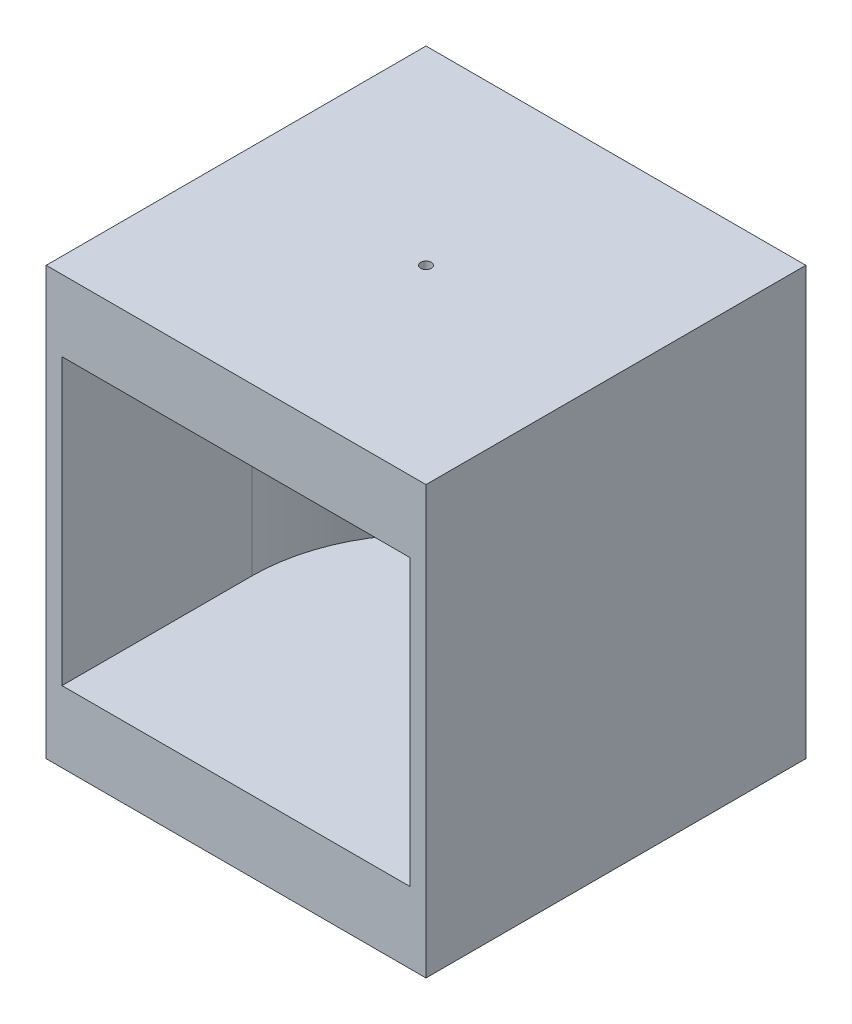
ISO-10303-21;
HEADER;
FILE_DESCRIPTION(('STEP AP214'),'2;1');
FILE_NAME('part.step','',(''),(''),'','','');
FILE_SCHEMA(('AUTOMOTIVE_DESIGN { 1 0 10303 214 1 1 1 1 }'));
ENDSEC;
DATA;
#1=APPLICATION_CONTEXT('core data for automotive mechanical design processes');
#2=APPLICATION_PROTOCOL_DEFINITION('international standard','automotive_design',2000,#1);
#3=PRODUCT_CONTEXT('',#1,'mechanical');
#4=PRODUCT('Part','Part','',(#3));
#5=PRODUCT_RELATED_PRODUCT_CATEGORY('part','',(#4));
#6=PRODUCT_DEFINITION_FORMATION('','',#4);
#7=PRODUCT_DEFINITION_CONTEXT('part definition',#1,'design');
#8=PRODUCT_DEFINITION('design','',#6,#7);
#9=PRODUCT_DEFINITION_SHAPE('','',#8);
#10=(LENGTH_UNIT() NAMED_UNIT(*) SI_UNIT(.MILLI.,.METRE.));
#11=(NAMED_UNIT(*) PLANE_ANGLE_UNIT() SI_UNIT($,.RADIAN.));
#12=(NAMED_UNIT(*) SI_UNIT($,.STERADIAN.) SOLID_ANGLE_UNIT());
#13=UNCERTAINTY_MEASURE_WITH_UNIT(LENGTH_MEASURE(1.E-05),#10,'distance_accuracy_value','');
#14=(GEOMETRIC_REPRESENTATION_CONTEXT(3) GLOBAL_UNCERTAINTY_ASSIGNED_CONTEXT((#13)) GLOBAL_UNIT_ASSIGNED_CONTEXT((#10,
#11,#12)) REPRESENTATION_CONTEXT('',''));
#15=CARTESIAN_POINT('',(0.,0.,0.));
#16=DIRECTION('',(0.,0.,1.));
#17=DIRECTION('',(1.,0.,0.));
#18=AXIS2_PLACEMENT_3D('',#15,#16,#17);
#19=CARTESIAN_POINT('',(-360.,405.,360.));
#20=DIRECTION('',(0.,0.,-1.));
#21=DIRECTION('',(-1.,0.,0.));
#22=AXIS2_PLACEMENT_3D('',#19,#20,#21);
#23=PLANE('',#22);
#24=DIRECTION('',(1.,0.,0.));
#25=VECTOR('',#24,1.);
#26=CARTESIAN_POINT('',(-360.,-405.,360.));
#27=LINE('',#26,#25);
#28=CARTESIAN_POINT('',(-360.,-405.,360.));
#29=VERTEX_POINT('',#28);
#30=CARTESIAN_POINT('',(360.,-405.,360.));
#31=VERTEX_POINT('',#30);
#32=EDGE_CURVE('E84',#29,#31,#27,.T.);
#33=ORIENTED_EDGE('',*,*,#32,.T.);
#34=DIRECTION('',(0.,-1.,0.));
#35=VECTOR('',#34,1.);
#36=CARTESIAN_POINT('',(360.,405.,360.));
#37=LINE('',#36,#35);
#38=CARTESIAN_POINT('',(360.,405.,360.));
#39=VERTEX_POINT('',#38);
#40=EDGE_CURVE('E163',#39,#31,#37,.T.);
#41=ORIENTED_EDGE('',*,*,#40,.F.);
#42=DIRECTION('',(1.,0.,0.));
#43=VECTOR('',#42,1.);
#44=CARTESIAN_POINT('',(-360.,405.,360.));
#45=LINE('',#44,#43);
#46=CARTESIAN_POINT('',(-360.,405.,360.));
#47=VERTEX_POINT('',#46);
#48=EDGE_CURVE('E63',#47,#39,#45,.T.);
#49=ORIENTED_EDGE('',*,*,#48,.F.);
#50=DIRECTION('',(0.,-1.,0.));
#51=VECTOR('',#50,1.);
#52=CARTESIAN_POINT('',(-360.,405.,360.));
#53=LINE('',#52,#51);
#54=EDGE_CURVE('E172',#47,#29,#53,.T.);
#55=ORIENTED_EDGE('',*,*,#54,.T.);
#56=EDGE_LOOP('',(#33,#41,#49,#55));
#57=FACE_BOUND('',#56,.T.);
#58=DIRECTION('',(1.,0.,0.));
#59=VECTOR('',#58,1.);
#60=CARTESIAN_POINT('',(-330.,-270.,360.));
#61=LINE('',#60,#59);
#62=CARTESIAN_POINT('',(-330.,-270.,360.));
#63=VERTEX_POINT('',#62);
#64=CARTESIAN_POINT('',(330.,-270.,360.));
#65=VERTEX_POINT('',#64);
#66=EDGE_CURVE('E133',#63,#65,#61,.T.);
#67=ORIENTED_EDGE('',*,*,#66,.F.);
#68=DIRECTION('',(0.,1.,0.));
#69=VECTOR('',#68,1.);
#70=CARTESIAN_POINT('',(-330.,-270.,360.));
#71=LINE('',#70,#69);
#72=CARTESIAN_POINT('',(-330.,270.,360.));
#73=VERTEX_POINT('',#72);
#74=EDGE_CURVE('E124',#63,#73,#71,.T.);
#75=ORIENTED_EDGE('',*,*,#74,.T.);
#76=DIRECTION('',(1.,0.,0.));
#77=VECTOR('',#76,1.);
#78=CARTESIAN_POINT('',(-330.,270.,360.));
#79=LINE('',#78,#77);
#80=CARTESIAN_POINT('',(330.,270.,360.));
#81=VERTEX_POINT('',#80);
#82=EDGE_CURVE('E138',#73,#81,#79,.T.);
#83=ORIENTED_EDGE('',*,*,#82,.T.);
#84=DIRECTION('',(0.,1.,0.));
#85=VECTOR('',#84,1.);
#86=CARTESIAN_POINT('',(330.,-270.,360.));
#87=LINE('',#86,#85);
#88=EDGE_CURVE('E154',#65,#81,#87,.T.);
#89=ORIENTED_EDGE('',*,*,#88,.F.);
#90=EDGE_LOOP('',(#67,#75,#83,#89));
#91=FACE_BOUND('',#90,.T.);
#92=ADVANCED_FACE('F38',(#57,#91),#23,.F.);
#93=CARTESIAN_POINT('',(360.,405.,360.));
#94=DIRECTION('',(-1.,0.,0.));
#95=DIRECTION('',(0.,0.,1.));
#96=AXIS2_PLACEMENT_3D('',#93,#94,#95);
#97=PLANE('',#96);
#98=DIRECTION('',(0.,0.,-1.));
#99=VECTOR('',#98,1.);
#100=CARTESIAN_POINT('',(360.,-405.,360.));
#101=LINE('',#100,#99);
#102=CARTESIAN_POINT('',(360.,-405.,-360.));
#103=VERTEX_POINT('',#102);
#104=EDGE_CURVE('E153',#31,#103,#101,.T.);
#105=ORIENTED_EDGE('',*,*,#104,.T.);
#106=DIRECTION('',(0.,-1.,0.));
#107=VECTOR('',#106,1.);
#108=CARTESIAN_POINT('',(360.,405.,-360.));
#109=LINE('',#108,#107);
#110=CARTESIAN_POINT('',(360.,405.,-360.));
#111=VERTEX_POINT('',#110);
#112=EDGE_CURVE('E11',#111,#103,#109,.T.);
#113=ORIENTED_EDGE('',*,*,#112,.F.);
#114=DIRECTION('',(0.,0.,-1.));
#115=VECTOR('',#114,1.);
#116=CARTESIAN_POINT('',(360.,405.,360.));
#117=LINE('',#116,#115);
#118=EDGE_CURVE('E157',#39,#111,#117,.T.);
#119=ORIENTED_EDGE('',*,*,#118,.F.);
#120=ORIENTED_EDGE('',*,*,#40,.T.);
#121=EDGE_LOOP('',(#105,#113,#119,#120));
#122=FACE_BOUND('',#121,.T.);
#123=ADVANCED_FACE('F40',(#122),#97,.F.);
#124=CARTESIAN_POINT('',(-360.,405.,-360.));
#125=DIRECTION('',(0.,0.,1.));
#126=DIRECTION('',(1.,0.,0.));
#127=AXIS2_PLACEMENT_3D('',#124,#125,#126);
#128=PLANE('',#127);
#129=DIRECTION('',(-1.,0.,0.));
#130=VECTOR('',#129,1.);
#131=CARTESIAN_POINT('',(-360.,-405.,-360.));
#132=LINE('',#131,#130);
#133=CARTESIAN_POINT('',(-360.,-405.,-360.));
#134=VERTEX_POINT('',#133);
#135=EDGE_CURVE('E166',#103,#134,#132,.T.);
#136=ORIENTED_EDGE('',*,*,#135,.T.);
#137=DIRECTION('',(0.,-1.,0.));
#138=VECTOR('',#137,1.);
#139=CARTESIAN_POINT('',(-360.,405.,-360.));
#140=LINE('',#139,#138);
#141=CARTESIAN_POINT('',(-360.,405.,-360.));
#142=VERTEX_POINT('',#141);
#143=EDGE_CURVE('E47',#142,#134,#140,.T.);
#144=ORIENTED_EDGE('',*,*,#143,.F.);
#145=DIRECTION('',(-1.,0.,0.));
#146=VECTOR('',#145,1.);
#147=CARTESIAN_POINT('',(-360.,405.,-360.));
#148=LINE('',#147,#146);
#149=EDGE_CURVE('E91',#111,#142,#148,.T.);
#150=ORIENTED_EDGE('',*,*,#149,.F.);
#151=ORIENTED_EDGE('',*,*,#112,.T.);
#152=EDGE_LOOP('',(#136,#144,#150,#151));
#153=FACE_BOUND('',#152,.T.);
#154=ADVANCED_FACE('F222',(#153),#128,.F.);
#155=CARTESIAN_POINT('',(-360.,405.,360.));
#156=DIRECTION('',(1.,0.,0.));
#157=DIRECTION('',(0.,0.,-1.));
#158=AXIS2_PLACEMENT_3D('',#155,#156,#157);
#159=PLANE('',#158);
#160=DIRECTION('',(0.,0.,1.));
#161=VECTOR('',#160,1.);
#162=CARTESIAN_POINT('',(-360.,-405.,360.));
#163=LINE('',#162,#161);
#164=EDGE_CURVE('E168',#134,#29,#163,.T.);
#165=ORIENTED_EDGE('',*,*,#164,.T.);
#166=ORIENTED_EDGE('',*,*,#54,.F.);
#167=DIRECTION('',(0.,0.,1.));
#168=VECTOR('',#167,1.);
#169=CARTESIAN_POINT('',(-360.,405.,360.));
#170=LINE('',#169,#168);
#171=EDGE_CURVE('E160',#142,#47,#170,.T.);
#172=ORIENTED_EDGE('',*,*,#171,.F.);
#173=ORIENTED_EDGE('',*,*,#143,.T.);
#174=EDGE_LOOP('',(#165,#166,#172,#173));
#175=FACE_BOUND('',#174,.T.);
#176=ADVANCED_FACE('F178',(#175),#159,.F.);
#177=CARTESIAN_POINT('',(0.,405.,0.));
#178=DIRECTION('',(0.,-1.,0.));
#179=DIRECTION('',(0.,0.,-1.));
#180=AXIS2_PLACEMENT_3D('',#177,#178,#179);
#181=PLANE('',#180);
#182=CARTESIAN_POINT('',(0.,405.,0.));
#183=DIRECTION('',(0.,1.,0.));
#184=DIRECTION('',(0.,0.,1.));
#185=AXIS2_PLACEMENT_3D('',#182,#183,#184);
#186=CIRCLE('',#185,10.);
#187=CARTESIAN_POINT('',(0.,405.,10.));
#188=VERTEX_POINT('',#187);
#189=EDGE_CURVE('E316',#188,#188,#186,.T.);
#190=ORIENTED_EDGE('',*,*,#189,.F.);
#191=EDGE_LOOP('',(#190));
#192=FACE_BOUND('',#191,.T.);
#193=ORIENTED_EDGE('',*,*,#118,.T.);
#194=ORIENTED_EDGE('',*,*,#149,.T.);
#195=ORIENTED_EDGE('',*,*,#171,.T.);
#196=ORIENTED_EDGE('',*,*,#48,.T.);
#197=EDGE_LOOP('',(#193,#194,#195,#196));
#198=FACE_BOUND('',#197,.T.);
#199=ADVANCED_FACE('F214',(#192,#198),#181,.F.);
#200=CARTESIAN_POINT('',(0.,-405.,0.));
#201=DIRECTION('',(0.,-1.,0.));
#202=DIRECTION('',(0.,0.,-1.));
#203=AXIS2_PLACEMENT_3D('',#200,#201,#202);
#204=PLANE('',#203);
#205=CARTESIAN_POINT('',(0.,-405.,0.));
#206=DIRECTION('',(0.,1.,0.));
#207=DIRECTION('',(0.,0.,1.));
#208=AXIS2_PLACEMENT_3D('',#205,#206,#207);
#209=CIRCLE('',#208,10.);
#210=CARTESIAN_POINT('',(0.,-405.,10.));
#211=VERTEX_POINT('',#210);
#212=EDGE_CURVE('E315',#211,#211,#209,.T.);
#213=ORIENTED_EDGE('',*,*,#212,.T.);
#214=EDGE_LOOP('',(#213));
#215=FACE_BOUND('',#214,.T.);
#216=ORIENTED_EDGE('',*,*,#104,.F.);
#217=ORIENTED_EDGE('',*,*,#32,.F.);
#218=ORIENTED_EDGE('',*,*,#164,.F.);
#219=ORIENTED_EDGE('',*,*,#135,.F.);
#220=EDGE_LOOP('',(#216,#217,#218,#219));
#221=FACE_BOUND('',#220,.T.);
#222=ADVANCED_FACE('F182',(#215,#221),#204,.T.);
#223=CARTESIAN_POINT('',(0.,-270.,0.));
#224=DIRECTION('',(0.,1.,0.));
#225=DIRECTION('',(0.,0.,1.));
#226=AXIS2_PLACEMENT_3D('',#223,#224,#225);
#227=CYLINDRICAL_SURFACE('',#226,330.);
#228=CARTESIAN_POINT('',(0.,270.,0.));
#229=DIRECTION('',(0.,1.,0.));
#230=DIRECTION('',(0.,0.,1.));
#231=AXIS2_PLACEMENT_3D('',#228,#229,#230);
#232=CIRCLE('',#231,330.);
#233=CARTESIAN_POINT('',(330.,270.,0.));
#234=VERTEX_POINT('',#233);
#235=CARTESIAN_POINT('',(-330.,270.,0.));
#236=VERTEX_POINT('',#235);
#237=EDGE_CURVE('E120',#234,#236,#232,.T.);
#238=ORIENTED_EDGE('',*,*,#237,.T.);
#239=DIRECTION('',(0.,1.,0.));
#240=VECTOR('',#239,1.);
#241=CARTESIAN_POINT('',(-330.,-270.,0.));
#242=LINE('',#241,#240);
#243=CARTESIAN_POINT('',(-330.,-270.,0.));
#244=VERTEX_POINT('',#243);
#245=EDGE_CURVE('E114',#244,#236,#242,.T.);
#246=ORIENTED_EDGE('',*,*,#245,.F.);
#247=CARTESIAN_POINT('',(0.,-270.,0.));
#248=DIRECTION('',(0.,1.,0.));
#249=DIRECTION('',(0.,0.,1.));
#250=AXIS2_PLACEMENT_3D('',#247,#248,#249);
#251=CIRCLE('',#250,330.);
#252=CARTESIAN_POINT('',(330.,-270.,0.));
#253=VERTEX_POINT('',#252);
#254=EDGE_CURVE('E118',#253,#244,#251,.T.);
#255=ORIENTED_EDGE('',*,*,#254,.F.);
#256=DIRECTION('',(0.,1.,0.));
#257=VECTOR('',#256,1.);
#258=CARTESIAN_POINT('',(330.,-270.,0.));
#259=LINE('',#258,#257);
#260=EDGE_CURVE('E151',#253,#234,#259,.T.);
#261=ORIENTED_EDGE('',*,*,#260,.T.);
#262=EDGE_LOOP('',(#238,#246,#255,#261));
#263=FACE_BOUND('',#262,.T.);
#264=ADVANCED_FACE('F116',(#263),#227,.F.);
#265=CARTESIAN_POINT('',(330.,-270.,0.));
#266=DIRECTION('',(1.,0.,0.));
#267=DIRECTION('',(0.,0.,-1.));
#268=AXIS2_PLACEMENT_3D('',#265,#266,#267);
#269=PLANE('',#268);
#270=DIRECTION('',(0.,0.,-1.));
#271=VECTOR('',#270,1.);
#272=CARTESIAN_POINT('',(330.,270.,0.));
#273=LINE('',#272,#271);
#274=EDGE_CURVE('E54',#81,#234,#273,.T.);
#275=ORIENTED_EDGE('',*,*,#274,.T.);
#276=ORIENTED_EDGE('',*,*,#260,.F.);
#277=DIRECTION('',(0.,0.,-1.));
#278=VECTOR('',#277,1.);
#279=CARTESIAN_POINT('',(330.,-270.,0.));
#280=LINE('',#279,#278);
#281=EDGE_CURVE('E125',#65,#253,#280,.T.);
#282=ORIENTED_EDGE('',*,*,#281,.F.);
#283=ORIENTED_EDGE('',*,*,#88,.T.);
#284=EDGE_LOOP('',(#275,#276,#282,#283));
#285=FACE_BOUND('',#284,.T.);
#286=ADVANCED_FACE('F191',(#285),#269,.F.);
#287=CARTESIAN_POINT('',(-330.,-270.,0.));
#288=DIRECTION('',(-1.,0.,0.));
#289=DIRECTION('',(0.,0.,1.));
#290=AXIS2_PLACEMENT_3D('',#287,#288,#289);
#291=PLANE('',#290);
#292=DIRECTION('',(0.,0.,1.));
#293=VECTOR('',#292,1.);
#294=CARTESIAN_POINT('',(-330.,270.,0.));
#295=LINE('',#294,#293);
#296=EDGE_CURVE('E147',#236,#73,#295,.T.);
#297=ORIENTED_EDGE('',*,*,#296,.T.);
#298=ORIENTED_EDGE('',*,*,#74,.F.);
#299=DIRECTION('',(0.,0.,1.));
#300=VECTOR('',#299,1.);
#301=CARTESIAN_POINT('',(-330.,-270.,0.));
#302=LINE('',#301,#300);
#303=EDGE_CURVE('E128',#244,#63,#302,.T.);
#304=ORIENTED_EDGE('',*,*,#303,.F.);
#305=ORIENTED_EDGE('',*,*,#245,.T.);
#306=EDGE_LOOP('',(#297,#298,#304,#305));
#307=FACE_BOUND('',#306,.T.);
#308=ADVANCED_FACE('F129',(#307),#291,.F.);
#309=CARTESIAN_POINT('',(0.,-270.,0.));
#310=DIRECTION('',(0.,1.,0.));
#311=DIRECTION('',(0.,0.,1.));
#312=AXIS2_PLACEMENT_3D('',#309,#310,#311);
#313=PLANE('',#312);
#314=CARTESIAN_POINT('',(0.,-270.,0.));
#315=DIRECTION('',(0.,1.,0.));
#316=DIRECTION('',(0.,0.,1.));
#317=AXIS2_PLACEMENT_3D('',#314,#315,#316);
#318=CIRCLE('',#317,10.);
#319=CARTESIAN_POINT('',(0.,-270.,10.));
#320=VERTEX_POINT('',#319);
#321=EDGE_CURVE('E141',#320,#320,#318,.T.);
#322=ORIENTED_EDGE('',*,*,#321,.F.);
#323=EDGE_LOOP('',(#322));
#324=FACE_BOUND('',#323,.T.);
#325=ORIENTED_EDGE('',*,*,#254,.T.);
#326=ORIENTED_EDGE('',*,*,#303,.T.);
#327=ORIENTED_EDGE('',*,*,#66,.T.);
#328=ORIENTED_EDGE('',*,*,#281,.T.);
#329=EDGE_LOOP('',(#325,#326,#327,#328));
#330=FACE_BOUND('',#329,.T.);
#331=ADVANCED_FACE('F135',(#324,#330),#313,.T.);
#332=CARTESIAN_POINT('',(0.,270.,0.));
#333=DIRECTION('',(0.,1.,0.));
#334=DIRECTION('',(0.,0.,1.));
#335=AXIS2_PLACEMENT_3D('',#332,#333,#334);
#336=PLANE('',#335);
#337=CARTESIAN_POINT('',(0.,270.,0.));
#338=DIRECTION('',(0.,1.,0.));
#339=DIRECTION('',(0.,0.,1.));
#340=AXIS2_PLACEMENT_3D('',#337,#338,#339);
#341=CIRCLE('',#340,10.);
#342=CARTESIAN_POINT('',(0.,270.,10.));
#343=VERTEX_POINT('',#342);
#344=EDGE_CURVE('E42',#343,#343,#341,.T.);
#345=ORIENTED_EDGE('',*,*,#344,.T.);
#346=EDGE_LOOP('',(#345));
#347=FACE_BOUND('',#346,.T.);
#348=ORIENTED_EDGE('',*,*,#237,.F.);
#349=ORIENTED_EDGE('',*,*,#274,.F.);
#350=ORIENTED_EDGE('',*,*,#82,.F.);
#351=ORIENTED_EDGE('',*,*,#296,.F.);
#352=EDGE_LOOP('',(#348,#349,#350,#351));
#353=FACE_BOUND('',#352,.T.);
#354=ADVANCED_FACE('F192',(#347,#353),#336,.F.);
#355=CARTESIAN_POINT('',(0.,-405.,0.));
#356=DIRECTION('',(0.,1.,0.));
#357=DIRECTION('',(0.,0.,1.));
#358=AXIS2_PLACEMENT_3D('',#355,#356,#357);
#359=CYLINDRICAL_SURFACE('',#358,10.);
#360=ORIENTED_EDGE('',*,*,#189,.T.);
#361=EDGE_LOOP('',(#360));
#362=FACE_BOUND('',#361,.T.);
#363=ORIENTED_EDGE('',*,*,#344,.F.);
#364=EDGE_LOOP('',(#363));
#365=FACE_BOUND('',#364,.T.);
#366=ADVANCED_FACE('F194',(#362,#365),#359,.F.);
#367=ORIENTED_EDGE('',*,*,#321,.T.);
#368=EDGE_LOOP('',(#367));
#369=FACE_BOUND('',#368,.T.);
#370=ORIENTED_EDGE('',*,*,#212,.F.);
#371=EDGE_LOOP('',(#370));
#372=FACE_BOUND('',#371,.T.);
#373=ADVANCED_FACE('F201',(#369,#372),#359,.F.);
#374=CLOSED_SHELL('',(#92,#123,#154,#176,#199,#222,#264,#286,#308,#331,#354,#366,#373));
#375=MANIFOLD_SOLID_BREP('B2',#374);
#376=ADVANCED_BREP_SHAPE_REPRESENTATION('',(#18,#375),#14);
#377=SHAPE_DEFINITION_REPRESENTATION(#9,#376);
ENDSEC;
END-ISO-10303-21;
